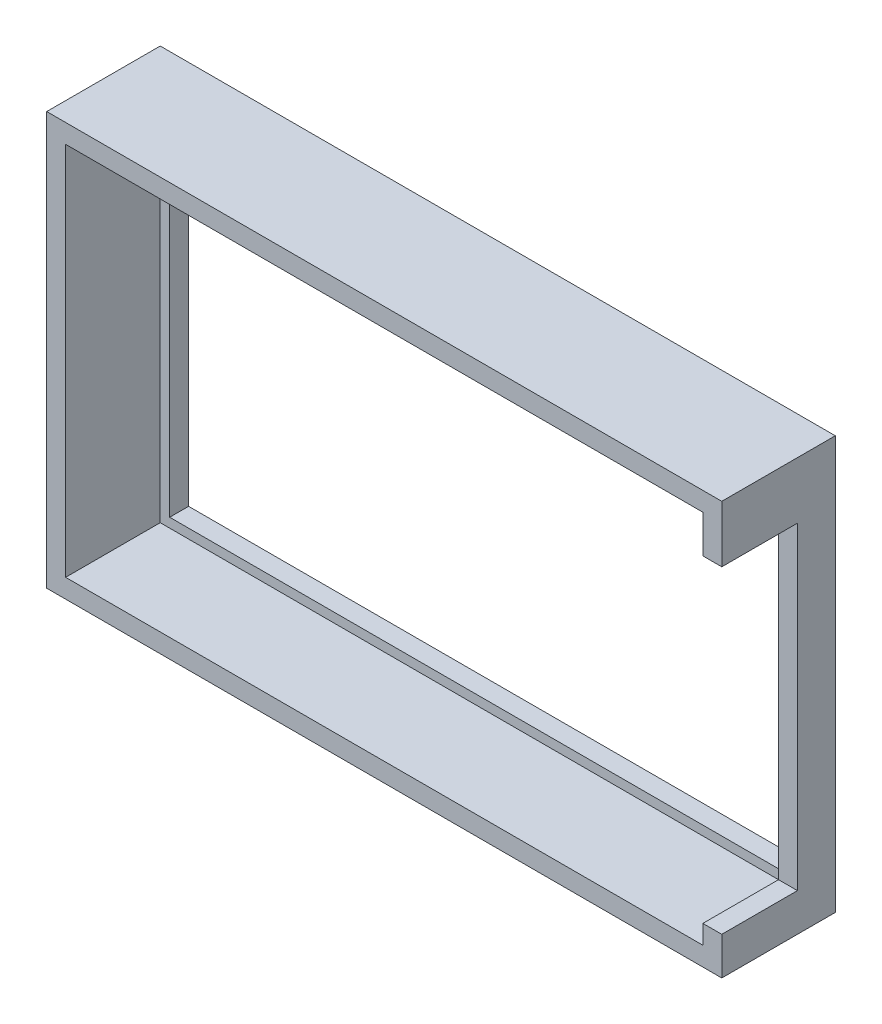
ISO-10303-21;
HEADER;
FILE_DESCRIPTION(('STEP AP214'),'2;1');
FILE_NAME('part.step','',(''),(''),'','','');
FILE_SCHEMA(('AUTOMOTIVE_DESIGN { 1 0 10303 214 1 1 1 1 }'));
ENDSEC;
DATA;
#1=APPLICATION_CONTEXT('core data for automotive mechanical design processes');
#2=APPLICATION_PROTOCOL_DEFINITION('international standard','automotive_design',2000,#1);
#3=PRODUCT_CONTEXT('',#1,'mechanical');
#4=PRODUCT('Part','Part','',(#3));
#5=PRODUCT_RELATED_PRODUCT_CATEGORY('part','',(#4));
#6=PRODUCT_DEFINITION_FORMATION('','',#4);
#7=PRODUCT_DEFINITION_CONTEXT('part definition',#1,'design');
#8=PRODUCT_DEFINITION('design','',#6,#7);
#9=PRODUCT_DEFINITION_SHAPE('','',#8);
#10=(LENGTH_UNIT() NAMED_UNIT(*) SI_UNIT(.MILLI.,.METRE.));
#11=(NAMED_UNIT(*) PLANE_ANGLE_UNIT() SI_UNIT($,.RADIAN.));
#12=(NAMED_UNIT(*) SI_UNIT($,.STERADIAN.) SOLID_ANGLE_UNIT());
#13=UNCERTAINTY_MEASURE_WITH_UNIT(LENGTH_MEASURE(1.E-05),#10,'distance_accuracy_value','');
#14=(GEOMETRIC_REPRESENTATION_CONTEXT(3) GLOBAL_UNCERTAINTY_ASSIGNED_CONTEXT((#13)) GLOBAL_UNIT_ASSIGNED_CONTEXT((#10,
#11,#12)) REPRESENTATION_CONTEXT('',''));
#15=CARTESIAN_POINT('',(0.,0.,0.));
#16=DIRECTION('',(0.,0.,1.));
#17=DIRECTION('',(1.,0.,0.));
#18=AXIS2_PLACEMENT_3D('',#15,#16,#17);
#19=CARTESIAN_POINT('',(0.,0.,1.));
#20=DIRECTION('',(0.,0.,-1.));
#21=DIRECTION('',(-1.,0.,0.));
#22=AXIS2_PLACEMENT_3D('',#19,#20,#21);
#23=PLANE('',#22);
#24=DIRECTION('',(0.,-1.,0.));
#25=VECTOR('',#24,1.);
#26=CARTESIAN_POINT('',(1.,1.,1.));
#27=LINE('',#26,#25);
#28=CARTESIAN_POINT('',(1.,20.82,1.));
#29=VERTEX_POINT('',#28);
#30=CARTESIAN_POINT('',(1.,1.,1.));
#31=VERTEX_POINT('',#30);
#32=EDGE_CURVE('E247',#29,#31,#27,.T.);
#33=ORIENTED_EDGE('',*,*,#32,.T.);
#34=DIRECTION('',(1.,0.,0.));
#35=VECTOR('',#34,1.);
#36=CARTESIAN_POINT('',(1.,1.,1.));
#37=LINE('',#36,#35);
#38=CARTESIAN_POINT('',(34.68,1.,1.));
#39=VERTEX_POINT('',#38);
#40=EDGE_CURVE('E250',#31,#39,#37,.T.);
#41=ORIENTED_EDGE('',*,*,#40,.T.);
#42=DIRECTION('',(0.,1.,0.));
#43=VECTOR('',#42,1.);
#44=CARTESIAN_POINT('',(34.68,1.,1.));
#45=LINE('',#44,#43);
#46=CARTESIAN_POINT('',(34.68,20.82,1.));
#47=VERTEX_POINT('',#46);
#48=EDGE_CURVE('E254',#39,#47,#45,.T.);
#49=ORIENTED_EDGE('',*,*,#48,.T.);
#50=DIRECTION('',(-1.,0.,0.));
#51=VECTOR('',#50,1.);
#52=CARTESIAN_POINT('',(1.,20.82,1.));
#53=LINE('',#52,#51);
#54=EDGE_CURVE('E257',#47,#29,#53,.T.);
#55=ORIENTED_EDGE('',*,*,#54,.T.);
#56=EDGE_LOOP('',(#33,#41,#49,#55));
#57=FACE_BOUND('',#56,.T.);
#58=DIRECTION('',(0.,-1.,0.));
#59=VECTOR('',#58,1.);
#60=CARTESIAN_POINT('',(1.5,1.5,1.));
#61=LINE('',#60,#59);
#62=CARTESIAN_POINT('',(1.5,20.32,1.));
#63=VERTEX_POINT('',#62);
#64=CARTESIAN_POINT('',(1.5,1.5,1.));
#65=VERTEX_POINT('',#64);
#66=EDGE_CURVE('E212',#63,#65,#61,.T.);
#67=ORIENTED_EDGE('',*,*,#66,.F.);
#68=DIRECTION('',(-1.,0.,0.));
#69=VECTOR('',#68,1.);
#70=CARTESIAN_POINT('',(1.5,20.32,1.));
#71=LINE('',#70,#69);
#72=CARTESIAN_POINT('',(34.18,20.32,1.));
#73=VERTEX_POINT('',#72);
#74=EDGE_CURVE('E221',#73,#63,#71,.T.);
#75=ORIENTED_EDGE('',*,*,#74,.F.);
#76=DIRECTION('',(0.,1.,0.));
#77=VECTOR('',#76,1.);
#78=CARTESIAN_POINT('',(34.18,1.5,1.));
#79=LINE('',#78,#77);
#80=CARTESIAN_POINT('',(34.18,1.5,1.));
#81=VERTEX_POINT('',#80);
#82=EDGE_CURVE('E56',#81,#73,#79,.T.);
#83=ORIENTED_EDGE('',*,*,#82,.F.);
#84=DIRECTION('',(1.,0.,0.));
#85=VECTOR('',#84,1.);
#86=CARTESIAN_POINT('',(1.5,1.5,1.));
#87=LINE('',#86,#85);
#88=EDGE_CURVE('E233',#65,#81,#87,.T.);
#89=ORIENTED_EDGE('',*,*,#88,.F.);
#90=EDGE_LOOP('',(#67,#75,#83,#89));
#91=FACE_BOUND('',#90,.T.);
#92=ADVANCED_FACE('F33',(#57,#91),#23,.F.);
#93=CARTESIAN_POINT('',(0.,0.,6.));
#94=DIRECTION('',(1.,0.,0.));
#95=DIRECTION('',(0.,0.,-1.));
#96=AXIS2_PLACEMENT_3D('',#93,#94,#95);
#97=PLANE('',#96);
#98=DIRECTION('',(0.,-1.,0.));
#99=VECTOR('',#98,1.);
#100=CARTESIAN_POINT('',(0.,0.,0.));
#101=LINE('',#100,#99);
#102=CARTESIAN_POINT('',(0.,21.82,0.));
#103=VERTEX_POINT('',#102);
#104=CARTESIAN_POINT('',(0.,0.,0.));
#105=VERTEX_POINT('',#104);
#106=EDGE_CURVE('E180',#103,#105,#101,.T.);
#107=ORIENTED_EDGE('',*,*,#106,.T.);
#108=DIRECTION('',(0.,0.,-1.));
#109=VECTOR('',#108,1.);
#110=CARTESIAN_POINT('',(0.,0.,6.));
#111=LINE('',#110,#109);
#112=CARTESIAN_POINT('',(0.,0.,6.));
#113=VERTEX_POINT('',#112);
#114=EDGE_CURVE('E198',#113,#105,#111,.T.);
#115=ORIENTED_EDGE('',*,*,#114,.F.);
#116=DIRECTION('',(0.,-1.,0.));
#117=VECTOR('',#116,1.);
#118=CARTESIAN_POINT('',(0.,0.,6.));
#119=LINE('',#118,#117);
#120=CARTESIAN_POINT('',(0.,21.82,6.));
#121=VERTEX_POINT('',#120);
#122=EDGE_CURVE('E190',#121,#113,#119,.T.);
#123=ORIENTED_EDGE('',*,*,#122,.F.);
#124=DIRECTION('',(0.,0.,-1.));
#125=VECTOR('',#124,1.);
#126=CARTESIAN_POINT('',(0.,21.82,6.));
#127=LINE('',#126,#125);
#128=EDGE_CURVE('E175',#121,#103,#127,.T.);
#129=ORIENTED_EDGE('',*,*,#128,.T.);
#130=EDGE_LOOP('',(#107,#115,#123,#129));
#131=FACE_BOUND('',#130,.T.);
#132=ADVANCED_FACE('F35',(#131),#97,.F.);
#133=CARTESIAN_POINT('',(0.,0.,6.));
#134=DIRECTION('',(0.,1.,0.));
#135=DIRECTION('',(0.,0.,1.));
#136=AXIS2_PLACEMENT_3D('',#133,#134,#135);
#137=PLANE('',#136);
#138=DIRECTION('',(1.,0.,0.));
#139=VECTOR('',#138,1.);
#140=CARTESIAN_POINT('',(0.,0.,0.));
#141=LINE('',#140,#139);
#142=CARTESIAN_POINT('',(35.68,0.,0.));
#143=VERTEX_POINT('',#142);
#144=EDGE_CURVE('E183',#105,#143,#141,.T.);
#145=ORIENTED_EDGE('',*,*,#144,.T.);
#146=DIRECTION('',(0.,0.,-1.));
#147=VECTOR('',#146,1.);
#148=CARTESIAN_POINT('',(35.68,0.,6.));
#149=LINE('',#148,#147);
#150=CARTESIAN_POINT('',(35.68,0.,6.));
#151=VERTEX_POINT('',#150);
#152=EDGE_CURVE('E196',#151,#143,#149,.T.);
#153=ORIENTED_EDGE('',*,*,#152,.F.);
#154=DIRECTION('',(1.,0.,0.));
#155=VECTOR('',#154,1.);
#156=CARTESIAN_POINT('',(0.,0.,6.));
#157=LINE('',#156,#155);
#158=EDGE_CURVE('E170',#113,#151,#157,.T.);
#159=ORIENTED_EDGE('',*,*,#158,.F.);
#160=ORIENTED_EDGE('',*,*,#114,.T.);
#161=EDGE_LOOP('',(#145,#153,#159,#160));
#162=FACE_BOUND('',#161,.T.);
#163=ADVANCED_FACE('F284',(#162),#137,.F.);
#164=CARTESIAN_POINT('',(35.68,0.,6.));
#165=DIRECTION('',(-1.,0.,0.));
#166=DIRECTION('',(0.,0.,1.));
#167=AXIS2_PLACEMENT_3D('',#164,#165,#166);
#168=PLANE('',#167);
#169=DIRECTION('',(0.,1.,0.));
#170=VECTOR('',#169,1.);
#171=CARTESIAN_POINT('',(35.68,0.,6.));
#172=LINE('',#171,#170);
#173=CARTESIAN_POINT('',(35.68,18.82,6.));
#174=VERTEX_POINT('',#173);
#175=CARTESIAN_POINT('',(35.68,21.82,6.));
#176=VERTEX_POINT('',#175);
#177=EDGE_CURVE('E173',#174,#176,#172,.T.);
#178=ORIENTED_EDGE('',*,*,#177,.F.);
#179=DIRECTION('',(0.,0.,1.));
#180=VECTOR('',#179,1.);
#181=CARTESIAN_POINT('',(35.68,18.82,6.));
#182=LINE('',#181,#180);
#183=CARTESIAN_POINT('',(35.68,18.82,2.));
#184=VERTEX_POINT('',#183);
#185=EDGE_CURVE('E155',#184,#174,#182,.T.);
#186=ORIENTED_EDGE('',*,*,#185,.F.);
#187=DIRECTION('',(0.,1.,0.));
#188=VECTOR('',#187,1.);
#189=CARTESIAN_POINT('',(35.68,18.82,2.));
#190=LINE('',#189,#188);
#191=CARTESIAN_POINT('',(35.68,2.,2.));
#192=VERTEX_POINT('',#191);
#193=EDGE_CURVE('E165',#192,#184,#190,.T.);
#194=ORIENTED_EDGE('',*,*,#193,.F.);
#195=DIRECTION('',(0.,0.,-1.));
#196=VECTOR('',#195,1.);
#197=CARTESIAN_POINT('',(35.68,2.,6.));
#198=LINE('',#197,#196);
#199=CARTESIAN_POINT('',(35.68,2.,6.));
#200=VERTEX_POINT('',#199);
#201=EDGE_CURVE('E147',#200,#192,#198,.T.);
#202=ORIENTED_EDGE('',*,*,#201,.F.);
#203=EDGE_CURVE('E162',#151,#200,#172,.T.);
#204=ORIENTED_EDGE('',*,*,#203,.F.);
#205=ORIENTED_EDGE('',*,*,#152,.T.);
#206=DIRECTION('',(0.,1.,0.));
#207=VECTOR('',#206,1.);
#208=CARTESIAN_POINT('',(35.68,0.,0.));
#209=LINE('',#208,#207);
#210=CARTESIAN_POINT('',(35.68,21.82,0.));
#211=VERTEX_POINT('',#210);
#212=EDGE_CURVE('E186',#143,#211,#209,.T.);
#213=ORIENTED_EDGE('',*,*,#212,.T.);
#214=DIRECTION('',(0.,0.,-1.));
#215=VECTOR('',#214,1.);
#216=CARTESIAN_POINT('',(35.68,21.82,6.));
#217=LINE('',#216,#215);
#218=EDGE_CURVE('E193',#176,#211,#217,.T.);
#219=ORIENTED_EDGE('',*,*,#218,.F.);
#220=EDGE_LOOP('',(#178,#186,#194,#202,#204,#205,#213,#219));
#221=FACE_BOUND('',#220,.T.);
#222=ADVANCED_FACE('F160',(#221),#168,.F.);
#223=CARTESIAN_POINT('',(0.,21.82,6.));
#224=DIRECTION('',(0.,-1.,0.));
#225=DIRECTION('',(0.,0.,-1.));
#226=AXIS2_PLACEMENT_3D('',#223,#224,#225);
#227=PLANE('',#226);
#228=DIRECTION('',(-1.,0.,0.));
#229=VECTOR('',#228,1.);
#230=CARTESIAN_POINT('',(0.,21.82,0.));
#231=LINE('',#230,#229);
#232=EDGE_CURVE('E188',#211,#103,#231,.T.);
#233=ORIENTED_EDGE('',*,*,#232,.T.);
#234=ORIENTED_EDGE('',*,*,#128,.F.);
#235=DIRECTION('',(-1.,0.,0.));
#236=VECTOR('',#235,1.);
#237=CARTESIAN_POINT('',(0.,21.82,6.));
#238=LINE('',#237,#236);
#239=EDGE_CURVE('E172',#176,#121,#238,.T.);
#240=ORIENTED_EDGE('',*,*,#239,.F.);
#241=ORIENTED_EDGE('',*,*,#218,.T.);
#242=EDGE_LOOP('',(#233,#234,#240,#241));
#243=FACE_BOUND('',#242,.T.);
#244=ADVANCED_FACE('F291',(#243),#227,.F.);
#245=CARTESIAN_POINT('',(0.,0.,6.));
#246=DIRECTION('',(0.,0.,-1.));
#247=DIRECTION('',(-1.,0.,0.));
#248=AXIS2_PLACEMENT_3D('',#245,#246,#247);
#249=PLANE('',#248);
#250=DIRECTION('',(0.,1.,0.));
#251=VECTOR('',#250,1.);
#252=CARTESIAN_POINT('',(34.68,1.,6.));
#253=LINE('',#252,#251);
#254=CARTESIAN_POINT('',(34.68,18.82,6.));
#255=VERTEX_POINT('',#254);
#256=CARTESIAN_POINT('',(34.68,20.82,6.));
#257=VERTEX_POINT('',#256);
#258=EDGE_CURVE('E265',#255,#257,#253,.T.);
#259=ORIENTED_EDGE('',*,*,#258,.F.);
#260=DIRECTION('',(1.,0.,0.));
#261=VECTOR('',#260,1.);
#262=CARTESIAN_POINT('',(30.68,18.82,6.));
#263=LINE('',#262,#261);
#264=EDGE_CURVE('E209',#255,#174,#263,.T.);
#265=ORIENTED_EDGE('',*,*,#264,.T.);
#266=ORIENTED_EDGE('',*,*,#177,.T.);
#267=ORIENTED_EDGE('',*,*,#239,.T.);
#268=ORIENTED_EDGE('',*,*,#122,.T.);
#269=ORIENTED_EDGE('',*,*,#158,.T.);
#270=ORIENTED_EDGE('',*,*,#203,.T.);
#271=DIRECTION('',(1.,0.,0.));
#272=VECTOR('',#271,1.);
#273=CARTESIAN_POINT('',(30.68,2.,6.));
#274=LINE('',#273,#272);
#275=CARTESIAN_POINT('',(34.68,2.,6.));
#276=VERTEX_POINT('',#275);
#277=EDGE_CURVE('E144',#276,#200,#274,.T.);
#278=ORIENTED_EDGE('',*,*,#277,.F.);
#279=CARTESIAN_POINT('',(34.68,1.,6.));
#280=VERTEX_POINT('',#279);
#281=EDGE_CURVE('E266',#280,#276,#253,.T.);
#282=ORIENTED_EDGE('',*,*,#281,.F.);
#283=DIRECTION('',(1.,0.,0.));
#284=VECTOR('',#283,1.);
#285=CARTESIAN_POINT('',(1.,1.,6.));
#286=LINE('',#285,#284);
#287=CARTESIAN_POINT('',(1.,1.,6.));
#288=VERTEX_POINT('',#287);
#289=EDGE_CURVE('E262',#288,#280,#286,.T.);
#290=ORIENTED_EDGE('',*,*,#289,.F.);
#291=DIRECTION('',(0.,-1.,0.));
#292=VECTOR('',#291,1.);
#293=CARTESIAN_POINT('',(1.,1.,6.));
#294=LINE('',#293,#292);
#295=CARTESIAN_POINT('',(1.,20.82,6.));
#296=VERTEX_POINT('',#295);
#297=EDGE_CURVE('E241',#296,#288,#294,.T.);
#298=ORIENTED_EDGE('',*,*,#297,.F.);
#299=DIRECTION('',(-1.,0.,0.));
#300=VECTOR('',#299,1.);
#301=CARTESIAN_POINT('',(1.,20.82,6.));
#302=LINE('',#301,#300);
#303=EDGE_CURVE('E251',#257,#296,#302,.T.);
#304=ORIENTED_EDGE('',*,*,#303,.F.);
#305=EDGE_LOOP('',(#259,#265,#266,#267,#268,#269,#270,#278,#282,#290,#298,#304));
#306=FACE_BOUND('',#305,.T.);
#307=ADVANCED_FACE('F168',(#306),#249,.F.);
#308=CARTESIAN_POINT('',(0.,0.,0.));
#309=DIRECTION('',(0.,0.,-1.));
#310=DIRECTION('',(-1.,0.,0.));
#311=AXIS2_PLACEMENT_3D('',#308,#309,#310);
#312=PLANE('',#311);
#313=DIRECTION('',(0.,-1.,0.));
#314=VECTOR('',#313,1.);
#315=CARTESIAN_POINT('',(1.5,1.5,0.));
#316=LINE('',#315,#314);
#317=CARTESIAN_POINT('',(1.5,20.32,0.));
#318=VERTEX_POINT('',#317);
#319=CARTESIAN_POINT('',(1.5,1.5,0.));
#320=VERTEX_POINT('',#319);
#321=EDGE_CURVE('E217',#318,#320,#316,.T.);
#322=ORIENTED_EDGE('',*,*,#321,.T.);
#323=DIRECTION('',(1.,0.,0.));
#324=VECTOR('',#323,1.);
#325=CARTESIAN_POINT('',(1.5,1.5,0.));
#326=LINE('',#325,#324);
#327=CARTESIAN_POINT('',(34.18,1.5,0.));
#328=VERTEX_POINT('',#327);
#329=EDGE_CURVE('E220',#320,#328,#326,.T.);
#330=ORIENTED_EDGE('',*,*,#329,.T.);
#331=DIRECTION('',(0.,1.,0.));
#332=VECTOR('',#331,1.);
#333=CARTESIAN_POINT('',(34.18,1.5,0.));
#334=LINE('',#333,#332);
#335=CARTESIAN_POINT('',(34.18,20.32,0.));
#336=VERTEX_POINT('',#335);
#337=EDGE_CURVE('E224',#328,#336,#334,.T.);
#338=ORIENTED_EDGE('',*,*,#337,.T.);
#339=DIRECTION('',(-1.,0.,0.));
#340=VECTOR('',#339,1.);
#341=CARTESIAN_POINT('',(1.5,20.32,0.));
#342=LINE('',#341,#340);
#343=EDGE_CURVE('E227',#336,#318,#342,.T.);
#344=ORIENTED_EDGE('',*,*,#343,.T.);
#345=EDGE_LOOP('',(#322,#330,#338,#344));
#346=FACE_BOUND('',#345,.T.);
#347=ORIENTED_EDGE('',*,*,#106,.F.);
#348=ORIENTED_EDGE('',*,*,#232,.F.);
#349=ORIENTED_EDGE('',*,*,#212,.F.);
#350=ORIENTED_EDGE('',*,*,#144,.F.);
#351=EDGE_LOOP('',(#347,#348,#349,#350));
#352=FACE_BOUND('',#351,.T.);
#353=ADVANCED_FACE('F289',(#346,#352),#312,.T.);
#354=CARTESIAN_POINT('',(1.,1.,1.));
#355=DIRECTION('',(-1.,0.,0.));
#356=DIRECTION('',(0.,0.,1.));
#357=AXIS2_PLACEMENT_3D('',#354,#355,#356);
#358=PLANE('',#357);
#359=ORIENTED_EDGE('',*,*,#297,.T.);
#360=DIRECTION('',(0.,0.,1.));
#361=VECTOR('',#360,1.);
#362=CARTESIAN_POINT('',(1.,1.,1.));
#363=LINE('',#362,#361);
#364=EDGE_CURVE('E260',#31,#288,#363,.T.);
#365=ORIENTED_EDGE('',*,*,#364,.F.);
#366=ORIENTED_EDGE('',*,*,#32,.F.);
#367=DIRECTION('',(0.,0.,1.));
#368=VECTOR('',#367,1.);
#369=CARTESIAN_POINT('',(1.,20.82,1.));
#370=LINE('',#369,#368);
#371=EDGE_CURVE('E184',#29,#296,#370,.T.);
#372=ORIENTED_EDGE('',*,*,#371,.T.);
#373=EDGE_LOOP('',(#359,#365,#366,#372));
#374=FACE_BOUND('',#373,.T.);
#375=ADVANCED_FACE('F319',(#374),#358,.F.);
#376=CARTESIAN_POINT('',(1.,20.82,1.));
#377=DIRECTION('',(0.,1.,0.));
#378=DIRECTION('',(0.,0.,1.));
#379=AXIS2_PLACEMENT_3D('',#376,#377,#378);
#380=PLANE('',#379);
#381=ORIENTED_EDGE('',*,*,#303,.T.);
#382=ORIENTED_EDGE('',*,*,#371,.F.);
#383=ORIENTED_EDGE('',*,*,#54,.F.);
#384=DIRECTION('',(0.,0.,1.));
#385=VECTOR('',#384,1.);
#386=CARTESIAN_POINT('',(34.68,20.82,1.));
#387=LINE('',#386,#385);
#388=EDGE_CURVE('E271',#47,#257,#387,.T.);
#389=ORIENTED_EDGE('',*,*,#388,.T.);
#390=EDGE_LOOP('',(#381,#382,#383,#389));
#391=FACE_BOUND('',#390,.T.);
#392=ADVANCED_FACE('F316',(#391),#380,.F.);
#393=CARTESIAN_POINT('',(34.68,1.,1.));
#394=DIRECTION('',(1.,0.,0.));
#395=DIRECTION('',(0.,0.,-1.));
#396=AXIS2_PLACEMENT_3D('',#393,#394,#395);
#397=PLANE('',#396);
#398=DIRECTION('',(0.,1.,0.));
#399=VECTOR('',#398,1.);
#400=CARTESIAN_POINT('',(34.68,1.,2.));
#401=LINE('',#400,#399);
#402=CARTESIAN_POINT('',(34.68,2.,2.));
#403=VERTEX_POINT('',#402);
#404=CARTESIAN_POINT('',(34.68,18.82,2.));
#405=VERTEX_POINT('',#404);
#406=EDGE_CURVE('E41',#403,#405,#401,.T.);
#407=ORIENTED_EDGE('',*,*,#406,.T.);
#408=DIRECTION('',(0.,0.,1.));
#409=VECTOR('',#408,1.);
#410=CARTESIAN_POINT('',(34.68,18.82,1.));
#411=LINE('',#410,#409);
#412=EDGE_CURVE('E11',#405,#255,#411,.T.);
#413=ORIENTED_EDGE('',*,*,#412,.T.);
#414=ORIENTED_EDGE('',*,*,#258,.T.);
#415=ORIENTED_EDGE('',*,*,#388,.F.);
#416=ORIENTED_EDGE('',*,*,#48,.F.);
#417=DIRECTION('',(0.,0.,1.));
#418=VECTOR('',#417,1.);
#419=CARTESIAN_POINT('',(34.68,1.,1.));
#420=LINE('',#419,#418);
#421=EDGE_CURVE('E274',#39,#280,#420,.T.);
#422=ORIENTED_EDGE('',*,*,#421,.T.);
#423=ORIENTED_EDGE('',*,*,#281,.T.);
#424=DIRECTION('',(0.,0.,-1.));
#425=VECTOR('',#424,1.);
#426=CARTESIAN_POINT('',(34.68,2.,1.));
#427=LINE('',#426,#425);
#428=EDGE_CURVE('E150',#276,#403,#427,.T.);
#429=ORIENTED_EDGE('',*,*,#428,.T.);
#430=EDGE_LOOP('',(#407,#413,#414,#415,#416,#422,#423,#429));
#431=FACE_BOUND('',#430,.T.);
#432=ADVANCED_FACE('F203',(#431),#397,.F.);
#433=CARTESIAN_POINT('',(1.,1.,1.));
#434=DIRECTION('',(0.,-1.,0.));
#435=DIRECTION('',(0.,0.,-1.));
#436=AXIS2_PLACEMENT_3D('',#433,#434,#435);
#437=PLANE('',#436);
#438=ORIENTED_EDGE('',*,*,#289,.T.);
#439=ORIENTED_EDGE('',*,*,#421,.F.);
#440=ORIENTED_EDGE('',*,*,#40,.F.);
#441=ORIENTED_EDGE('',*,*,#364,.T.);
#442=EDGE_LOOP('',(#438,#439,#440,#441));
#443=FACE_BOUND('',#442,.T.);
#444=ADVANCED_FACE('F323',(#443),#437,.F.);
#445=CARTESIAN_POINT('',(1.5,1.5,0.));
#446=DIRECTION('',(-1.,0.,0.));
#447=DIRECTION('',(0.,0.,1.));
#448=AXIS2_PLACEMENT_3D('',#445,#446,#447);
#449=PLANE('',#448);
#450=ORIENTED_EDGE('',*,*,#66,.T.);
#451=DIRECTION('',(0.,0.,1.));
#452=VECTOR('',#451,1.);
#453=CARTESIAN_POINT('',(1.5,1.5,0.));
#454=LINE('',#453,#452);
#455=EDGE_CURVE('E230',#320,#65,#454,.T.);
#456=ORIENTED_EDGE('',*,*,#455,.F.);
#457=ORIENTED_EDGE('',*,*,#321,.F.);
#458=DIRECTION('',(0.,0.,1.));
#459=VECTOR('',#458,1.);
#460=CARTESIAN_POINT('',(1.5,20.32,0.));
#461=LINE('',#460,#459);
#462=EDGE_CURVE('E239',#318,#63,#461,.T.);
#463=ORIENTED_EDGE('',*,*,#462,.T.);
#464=EDGE_LOOP('',(#450,#456,#457,#463));
#465=FACE_BOUND('',#464,.T.);
#466=ADVANCED_FACE('F315',(#465),#449,.F.);
#467=CARTESIAN_POINT('',(1.5,20.32,0.));
#468=DIRECTION('',(0.,1.,0.));
#469=DIRECTION('',(0.,0.,1.));
#470=AXIS2_PLACEMENT_3D('',#467,#468,#469);
#471=PLANE('',#470);
#472=ORIENTED_EDGE('',*,*,#74,.T.);
#473=ORIENTED_EDGE('',*,*,#462,.F.);
#474=ORIENTED_EDGE('',*,*,#343,.F.);
#475=DIRECTION('',(0.,0.,1.));
#476=VECTOR('',#475,1.);
#477=CARTESIAN_POINT('',(34.18,20.32,0.));
#478=LINE('',#477,#476);
#479=EDGE_CURVE('E242',#336,#73,#478,.T.);
#480=ORIENTED_EDGE('',*,*,#479,.T.);
#481=EDGE_LOOP('',(#472,#473,#474,#480));
#482=FACE_BOUND('',#481,.T.);
#483=ADVANCED_FACE('F382',(#482),#471,.F.);
#484=CARTESIAN_POINT('',(34.18,1.5,0.));
#485=DIRECTION('',(1.,0.,0.));
#486=DIRECTION('',(0.,0.,-1.));
#487=AXIS2_PLACEMENT_3D('',#484,#485,#486);
#488=PLANE('',#487);
#489=ORIENTED_EDGE('',*,*,#82,.T.);
#490=ORIENTED_EDGE('',*,*,#479,.F.);
#491=ORIENTED_EDGE('',*,*,#337,.F.);
#492=DIRECTION('',(0.,0.,1.));
#493=VECTOR('',#492,1.);
#494=CARTESIAN_POINT('',(34.18,1.5,0.));
#495=LINE('',#494,#493);
#496=EDGE_CURVE('E244',#328,#81,#495,.T.);
#497=ORIENTED_EDGE('',*,*,#496,.T.);
#498=EDGE_LOOP('',(#489,#490,#491,#497));
#499=FACE_BOUND('',#498,.T.);
#500=ADVANCED_FACE('F303',(#499),#488,.F.);
#501=CARTESIAN_POINT('',(1.5,1.5,0.));
#502=DIRECTION('',(0.,-1.,0.));
#503=DIRECTION('',(0.,0.,-1.));
#504=AXIS2_PLACEMENT_3D('',#501,#502,#503);
#505=PLANE('',#504);
#506=ORIENTED_EDGE('',*,*,#88,.T.);
#507=ORIENTED_EDGE('',*,*,#496,.F.);
#508=ORIENTED_EDGE('',*,*,#329,.F.);
#509=ORIENTED_EDGE('',*,*,#455,.T.);
#510=EDGE_LOOP('',(#506,#507,#508,#509));
#511=FACE_BOUND('',#510,.T.);
#512=ADVANCED_FACE('F296',(#511),#505,.F.);
#513=CARTESIAN_POINT('',(30.68,18.82,6.));
#514=DIRECTION('',(0.,1.,0.));
#515=DIRECTION('',(0.,0.,1.));
#516=AXIS2_PLACEMENT_3D('',#513,#514,#515);
#517=PLANE('',#516);
#518=DIRECTION('',(1.,0.,0.));
#519=VECTOR('',#518,1.);
#520=CARTESIAN_POINT('',(30.68,18.82,2.));
#521=LINE('',#520,#519);
#522=EDGE_CURVE('E207',#405,#184,#521,.T.);
#523=ORIENTED_EDGE('',*,*,#522,.T.);
#524=ORIENTED_EDGE('',*,*,#185,.T.);
#525=ORIENTED_EDGE('',*,*,#264,.F.);
#526=ORIENTED_EDGE('',*,*,#412,.F.);
#527=EDGE_LOOP('',(#523,#524,#525,#526));
#528=FACE_BOUND('',#527,.T.);
#529=ADVANCED_FACE('F293',(#528),#517,.F.);
#530=CARTESIAN_POINT('',(30.68,18.82,2.));
#531=DIRECTION('',(0.,0.,-1.));
#532=DIRECTION('',(0.,1.,0.));
#533=AXIS2_PLACEMENT_3D('',#530,#531,#532);
#534=PLANE('',#533);
#535=DIRECTION('',(1.,0.,0.));
#536=VECTOR('',#535,1.);
#537=CARTESIAN_POINT('',(30.68,2.,2.));
#538=LINE('',#537,#536);
#539=EDGE_CURVE('E48',#403,#192,#538,.T.);
#540=ORIENTED_EDGE('',*,*,#539,.T.);
#541=ORIENTED_EDGE('',*,*,#193,.T.);
#542=ORIENTED_EDGE('',*,*,#522,.F.);
#543=ORIENTED_EDGE('',*,*,#406,.F.);
#544=EDGE_LOOP('',(#540,#541,#542,#543));
#545=FACE_BOUND('',#544,.T.);
#546=ADVANCED_FACE('F206',(#545),#534,.F.);
#547=CARTESIAN_POINT('',(30.68,2.,6.));
#548=DIRECTION('',(0.,-1.,0.));
#549=DIRECTION('',(0.,0.,-1.));
#550=AXIS2_PLACEMENT_3D('',#547,#548,#549);
#551=PLANE('',#550);
#552=ORIENTED_EDGE('',*,*,#277,.T.);
#553=ORIENTED_EDGE('',*,*,#201,.T.);
#554=ORIENTED_EDGE('',*,*,#539,.F.);
#555=ORIENTED_EDGE('',*,*,#428,.F.);
#556=EDGE_LOOP('',(#552,#553,#554,#555));
#557=FACE_BOUND('',#556,.T.);
#558=ADVANCED_FACE('F146',(#557),#551,.F.);
#559=CLOSED_SHELL('',(#92,#132,#163,#222,#244,#307,#353,#375,#392,#432,#444,#466,#483,#500,#512,
#529,#546,#558));
#560=MANIFOLD_SOLID_BREP('B2',#559);
#561=ADVANCED_BREP_SHAPE_REPRESENTATION('',(#18,#560),#14);
#562=SHAPE_DEFINITION_REPRESENTATION(#9,#561);
ENDSEC;
END-ISO-10303-21;
